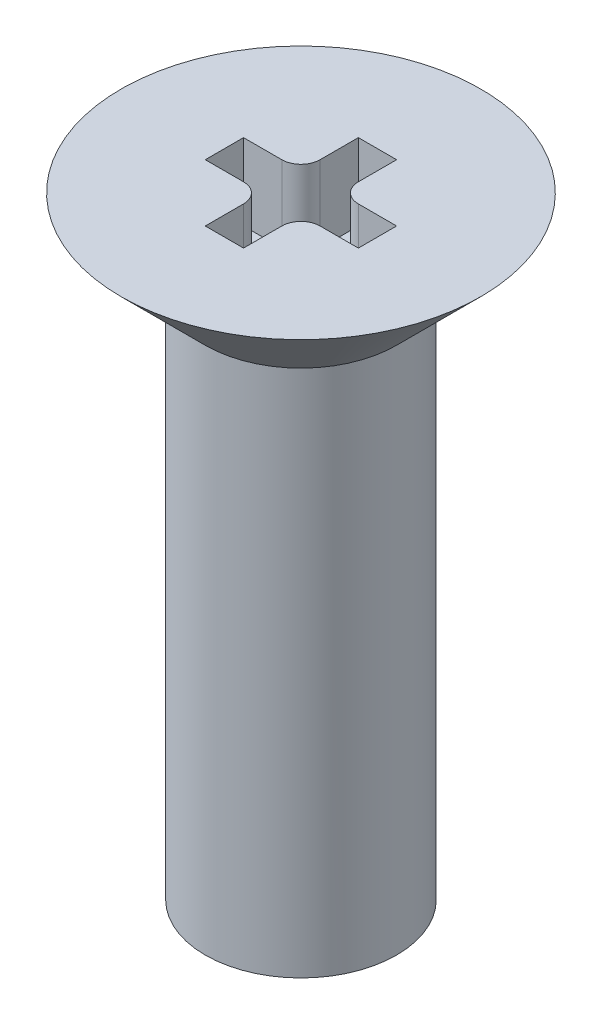
ISO-10303-21;
HEADER;
FILE_DESCRIPTION(('STEP AP214'),'2;1');
FILE_NAME('part.step','',(''),(''),'','','');
FILE_SCHEMA(('AUTOMOTIVE_DESIGN { 1 0 10303 214 1 1 1 1 }'));
ENDSEC;
DATA;
#1=APPLICATION_CONTEXT('core data for automotive mechanical design processes');
#2=APPLICATION_PROTOCOL_DEFINITION('international standard','automotive_design',2000,#1);
#3=PRODUCT_CONTEXT('',#1,'mechanical');
#4=PRODUCT('Part','Part','',(#3));
#5=PRODUCT_RELATED_PRODUCT_CATEGORY('part','',(#4));
#6=PRODUCT_DEFINITION_FORMATION('','',#4);
#7=PRODUCT_DEFINITION_CONTEXT('part definition',#1,'design');
#8=PRODUCT_DEFINITION('design','',#6,#7);
#9=PRODUCT_DEFINITION_SHAPE('','',#8);
#10=(LENGTH_UNIT() NAMED_UNIT(*) SI_UNIT(.MILLI.,.METRE.));
#11=(NAMED_UNIT(*) PLANE_ANGLE_UNIT() SI_UNIT($,.RADIAN.));
#12=(NAMED_UNIT(*) SI_UNIT($,.STERADIAN.) SOLID_ANGLE_UNIT());
#13=UNCERTAINTY_MEASURE_WITH_UNIT(LENGTH_MEASURE(1.E-05),#10,'distance_accuracy_value','');
#14=(GEOMETRIC_REPRESENTATION_CONTEXT(3) GLOBAL_UNCERTAINTY_ASSIGNED_CONTEXT((#13)) GLOBAL_UNIT_ASSIGNED_CONTEXT((#10,
#11,#12)) REPRESENTATION_CONTEXT('',''));
#15=CARTESIAN_POINT('',(0.,0.,0.));
#16=DIRECTION('',(0.,0.,1.));
#17=DIRECTION('',(1.,0.,0.));
#18=AXIS2_PLACEMENT_3D('',#15,#16,#17);
#19=CARTESIAN_POINT('',(0.,0.,0.));
#20=DIRECTION('',(0.,1.,0.));
#21=DIRECTION('',(0.,0.,1.));
#22=AXIS2_PLACEMENT_3D('',#19,#20,#21);
#23=PLANE('',#22);
#24=CARTESIAN_POINT('',(0.,0.,0.));
#25=DIRECTION('',(0.,1.,0.));
#26=DIRECTION('',(0.,0.,1.));
#27=AXIS2_PLACEMENT_3D('',#24,#25,#26);
#28=CIRCLE('',#27,2.35);
#29=CARTESIAN_POINT('',(0.,0.,2.35));
#30=VERTEX_POINT('',#29);
#31=EDGE_CURVE('E11',#30,#30,#28,.T.);
#32=ORIENTED_EDGE('',*,*,#31,.T.);
#33=EDGE_LOOP('',(#32));
#34=FACE_BOUND('',#33,.T.);
#35=DIRECTION('',(-1.,0.,0.));
#36=VECTOR('',#35,1.);
#37=CARTESIAN_POINT('',(0.5,0.,-0.25));
#38=LINE('',#37,#36);
#39=CARTESIAN_POINT('',(0.999999999999998,0.,-0.25));
#40=VERTEX_POINT('',#39);
#41=CARTESIAN_POINT('',(0.499999999999998,0.,-0.25));
#42=VERTEX_POINT('',#41);
#43=EDGE_CURVE('E47',#40,#42,#38,.T.);
#44=ORIENTED_EDGE('',*,*,#43,.F.);
#45=DIRECTION('',(0.,0.,-1.));
#46=VECTOR('',#45,1.);
#47=CARTESIAN_POINT('',(0.999999999999998,0.,0.25));
#48=LINE('',#47,#46);
#49=CARTESIAN_POINT('',(0.999999999999998,0.,0.25));
#50=VERTEX_POINT('',#49);
#51=EDGE_CURVE('E220',#50,#40,#48,.T.);
#52=ORIENTED_EDGE('',*,*,#51,.F.);
#53=DIRECTION('',(1.,0.,0.));
#54=VECTOR('',#53,1.);
#55=CARTESIAN_POINT('',(0.5,0.,0.25));
#56=LINE('',#55,#54);
#57=CARTESIAN_POINT('',(0.5,0.,0.25));
#58=VERTEX_POINT('',#57);
#59=EDGE_CURVE('E218',#58,#50,#56,.T.);
#60=ORIENTED_EDGE('',*,*,#59,.F.);
#61=CARTESIAN_POINT('',(0.499999999999998,0.,0.5));
#62=DIRECTION('',(0.,-1.,0.));
#63=DIRECTION('',(0.,0.,1.));
#64=AXIS2_PLACEMENT_3D('',#61,#62,#63);
#65=CIRCLE('',#64,0.25);
#66=CARTESIAN_POINT('',(0.249999999999998,0.,0.500000000000002));
#67=VERTEX_POINT('',#66);
#68=EDGE_CURVE('E155',#67,#58,#65,.T.);
#69=ORIENTED_EDGE('',*,*,#68,.F.);
#70=DIRECTION('',(0.,0.,-1.));
#71=VECTOR('',#70,1.);
#72=CARTESIAN_POINT('',(0.249999999999998,0.,1.));
#73=LINE('',#72,#71);
#74=CARTESIAN_POINT('',(0.249999999999998,0.,1.));
#75=VERTEX_POINT('',#74);
#76=EDGE_CURVE('E214',#75,#67,#73,.T.);
#77=ORIENTED_EDGE('',*,*,#76,.F.);
#78=DIRECTION('',(1.,0.,0.));
#79=VECTOR('',#78,1.);
#80=CARTESIAN_POINT('',(-0.250000000000002,0.,1.));
#81=LINE('',#80,#79);
#82=CARTESIAN_POINT('',(-0.250000000000002,0.,1.));
#83=VERTEX_POINT('',#82);
#84=EDGE_CURVE('E211',#83,#75,#81,.T.);
#85=ORIENTED_EDGE('',*,*,#84,.F.);
#86=DIRECTION('',(0.,0.,1.));
#87=VECTOR('',#86,1.);
#88=CARTESIAN_POINT('',(-0.250000000000002,0.,1.));
#89=LINE('',#88,#87);
#90=CARTESIAN_POINT('',(-0.250000000000002,0.,0.500000000000002));
#91=VERTEX_POINT('',#90);
#92=EDGE_CURVE('E208',#91,#83,#89,.T.);
#93=ORIENTED_EDGE('',*,*,#92,.F.);
#94=CARTESIAN_POINT('',(-0.500000000000002,0.,0.5));
#95=DIRECTION('',(0.,-1.,0.));
#96=DIRECTION('',(0.,0.,1.));
#97=AXIS2_PLACEMENT_3D('',#94,#95,#96);
#98=CIRCLE('',#97,0.25);
#99=CARTESIAN_POINT('',(-0.500000000000003,0.,0.25));
#100=VERTEX_POINT('',#99);
#101=EDGE_CURVE('E205',#100,#91,#98,.T.);
#102=ORIENTED_EDGE('',*,*,#101,.F.);
#103=DIRECTION('',(1.,0.,0.));
#104=VECTOR('',#103,1.);
#105=CARTESIAN_POINT('',(-1.,0.,0.25));
#106=LINE('',#105,#104);
#107=CARTESIAN_POINT('',(-1.,0.,0.25));
#108=VERTEX_POINT('',#107);
#109=EDGE_CURVE('E202',#108,#100,#106,.T.);
#110=ORIENTED_EDGE('',*,*,#109,.F.);
#111=DIRECTION('',(0.,0.,1.));
#112=VECTOR('',#111,1.);
#113=CARTESIAN_POINT('',(-1.,0.,0.25));
#114=LINE('',#113,#112);
#115=CARTESIAN_POINT('',(-1.,0.,-0.25));
#116=VERTEX_POINT('',#115);
#117=EDGE_CURVE('E199',#116,#108,#114,.T.);
#118=ORIENTED_EDGE('',*,*,#117,.F.);
#119=DIRECTION('',(-1.,0.,0.));
#120=VECTOR('',#119,1.);
#121=CARTESIAN_POINT('',(-1.,0.,-0.25));
#122=LINE('',#121,#120);
#123=CARTESIAN_POINT('',(-0.500000000000003,0.,-0.25));
#124=VERTEX_POINT('',#123);
#125=EDGE_CURVE('E196',#124,#116,#122,.T.);
#126=ORIENTED_EDGE('',*,*,#125,.F.);
#127=CARTESIAN_POINT('',(-0.500000000000002,0.,-0.5));
#128=DIRECTION('',(0.,-1.,0.));
#129=DIRECTION('',(0.,0.,1.));
#130=AXIS2_PLACEMENT_3D('',#127,#128,#129);
#131=CIRCLE('',#130,0.25);
#132=CARTESIAN_POINT('',(-0.250000000000002,0.,-0.500000000000001));
#133=VERTEX_POINT('',#132);
#134=EDGE_CURVE('E193',#133,#124,#131,.T.);
#135=ORIENTED_EDGE('',*,*,#134,.F.);
#136=DIRECTION('',(0.,0.,1.));
#137=VECTOR('',#136,1.);
#138=CARTESIAN_POINT('',(-0.250000000000002,0.,-0.500000000000002));
#139=LINE('',#138,#137);
#140=CARTESIAN_POINT('',(-0.250000000000002,0.,-1.));
#141=VERTEX_POINT('',#140);
#142=EDGE_CURVE('E190',#141,#133,#139,.T.);
#143=ORIENTED_EDGE('',*,*,#142,.F.);
#144=DIRECTION('',(-1.,0.,0.));
#145=VECTOR('',#144,1.);
#146=CARTESIAN_POINT('',(-0.250000000000002,0.,-1.));
#147=LINE('',#146,#145);
#148=CARTESIAN_POINT('',(0.249999999999998,0.,-1.));
#149=VERTEX_POINT('',#148);
#150=EDGE_CURVE('E187',#149,#141,#147,.T.);
#151=ORIENTED_EDGE('',*,*,#150,.F.);
#152=DIRECTION('',(0.,0.,-1.));
#153=VECTOR('',#152,1.);
#154=CARTESIAN_POINT('',(0.249999999999998,0.,-0.500000000000002));
#155=LINE('',#154,#153);
#156=CARTESIAN_POINT('',(0.249999999999998,0.,-0.500000000000002));
#157=VERTEX_POINT('',#156);
#158=EDGE_CURVE('E184',#157,#149,#155,.T.);
#159=ORIENTED_EDGE('',*,*,#158,.F.);
#160=CARTESIAN_POINT('',(0.499999999999998,0.,-0.5));
#161=DIRECTION('',(0.,-1.,0.));
#162=DIRECTION('',(0.,0.,1.));
#163=AXIS2_PLACEMENT_3D('',#160,#161,#162);
#164=CIRCLE('',#163,0.25);
#165=EDGE_CURVE('E181',#42,#157,#164,.T.);
#166=ORIENTED_EDGE('',*,*,#165,.F.);
#167=EDGE_LOOP('',(#44,#52,#60,#69,#77,#85,#93,#102,#110,#118,#126,#135,#143,#151,#159,#166));
#168=FACE_BOUND('',#167,.T.);
#169=ADVANCED_FACE('F33',(#34,#168),#23,.T.);
#170=CARTESIAN_POINT('',(0.,0.,0.));
#171=DIRECTION('',(0.,1.,0.));
#172=DIRECTION('',(0.,0.,1.));
#173=AXIS2_PLACEMENT_3D('',#170,#171,#172);
#174=CONICAL_SURFACE('',#173,2.35,0.785398163397447);
#175=CARTESIAN_POINT('',(0.,-1.1,0.));
#176=DIRECTION('',(0.,1.,0.));
#177=DIRECTION('',(0.,0.,1.));
#178=AXIS2_PLACEMENT_3D('',#175,#176,#177);
#179=CIRCLE('',#178,1.25);
#180=CARTESIAN_POINT('',(0.,-1.1,1.25));
#181=VERTEX_POINT('',#180);
#182=EDGE_CURVE('E40',#181,#181,#179,.T.);
#183=ORIENTED_EDGE('',*,*,#182,.T.);
#184=EDGE_LOOP('',(#183));
#185=FACE_BOUND('',#184,.T.);
#186=ORIENTED_EDGE('',*,*,#31,.F.);
#187=EDGE_LOOP('',(#186));
#188=FACE_BOUND('',#187,.T.);
#189=ADVANCED_FACE('F254',(#185,#188),#174,.T.);
#190=CARTESIAN_POINT('',(0.,0.872326938896606,0.));
#191=DIRECTION('',(0.,1.,0.));
#192=DIRECTION('',(0.,0.,1.));
#193=AXIS2_PLACEMENT_3D('',#190,#191,#192);
#194=CYLINDRICAL_SURFACE('',#193,1.25);
#195=ORIENTED_EDGE('',*,*,#182,.F.);
#196=EDGE_LOOP('',(#195));
#197=FACE_BOUND('',#196,.T.);
#198=CARTESIAN_POINT('',(0.,-8.,0.));
#199=DIRECTION('',(0.,-1.,0.));
#200=DIRECTION('',(0.,0.,-1.));
#201=AXIS2_PLACEMENT_3D('',#198,#199,#200);
#202=CIRCLE('',#201,1.25);
#203=CARTESIAN_POINT('',(0.,-8.,-1.25));
#204=VERTEX_POINT('',#203);
#205=EDGE_CURVE('E224',#204,#204,#202,.T.);
#206=ORIENTED_EDGE('',*,*,#205,.F.);
#207=EDGE_LOOP('',(#206));
#208=FACE_BOUND('',#207,.T.);
#209=ADVANCED_FACE('F257',(#197,#208),#194,.T.);
#210=CARTESIAN_POINT('',(0.,-8.,0.));
#211=DIRECTION('',(0.,-1.,0.));
#212=DIRECTION('',(0.,0.,-1.));
#213=AXIS2_PLACEMENT_3D('',#210,#211,#212);
#214=PLANE('',#213);
#215=ORIENTED_EDGE('',*,*,#205,.T.);
#216=EDGE_LOOP('',(#215));
#217=FACE_BOUND('',#216,.T.);
#218=ADVANCED_FACE('F260',(#217),#214,.T.);
#219=CARTESIAN_POINT('',(0.5,-1.,-0.25));
#220=DIRECTION('',(0.,0.,-1.));
#221=DIRECTION('',(-1.,0.,0.));
#222=AXIS2_PLACEMENT_3D('',#219,#220,#221);
#223=PLANE('',#222);
#224=ORIENTED_EDGE('',*,*,#43,.T.);
#225=DIRECTION('',(0.,1.,0.));
#226=VECTOR('',#225,1.);
#227=CARTESIAN_POINT('',(0.499999999999998,-1.,-0.25));
#228=LINE('',#227,#226);
#229=CARTESIAN_POINT('',(0.499999999999998,-1.,-0.25));
#230=VERTEX_POINT('',#229);
#231=EDGE_CURVE('E107',#230,#42,#228,.T.);
#232=ORIENTED_EDGE('',*,*,#231,.F.);
#233=DIRECTION('',(-1.,0.,0.));
#234=VECTOR('',#233,1.);
#235=CARTESIAN_POINT('',(0.5,-1.,-0.25));
#236=LINE('',#235,#234);
#237=CARTESIAN_POINT('',(0.999999999999998,-1.,-0.25));
#238=VERTEX_POINT('',#237);
#239=EDGE_CURVE('E222',#238,#230,#236,.T.);
#240=ORIENTED_EDGE('',*,*,#239,.F.);
#241=DIRECTION('',(0.,1.,0.));
#242=VECTOR('',#241,1.);
#243=CARTESIAN_POINT('',(0.999999999999998,-1.,-0.25));
#244=LINE('',#243,#242);
#245=EDGE_CURVE('E55',#238,#40,#244,.T.);
#246=ORIENTED_EDGE('',*,*,#245,.T.);
#247=EDGE_LOOP('',(#224,#232,#240,#246));
#248=FACE_BOUND('',#247,.T.);
#249=ADVANCED_FACE('F265',(#248),#223,.F.);
#250=CARTESIAN_POINT('',(0.999999999999998,-1.,0.25));
#251=DIRECTION('',(1.,0.,0.));
#252=DIRECTION('',(0.,0.,-1.));
#253=AXIS2_PLACEMENT_3D('',#250,#251,#252);
#254=PLANE('',#253);
#255=ORIENTED_EDGE('',*,*,#51,.T.);
#256=ORIENTED_EDGE('',*,*,#245,.F.);
#257=DIRECTION('',(0.,0.,-1.));
#258=VECTOR('',#257,1.);
#259=CARTESIAN_POINT('',(0.999999999999998,-1.,0.25));
#260=LINE('',#259,#258);
#261=CARTESIAN_POINT('',(0.999999999999998,-1.,0.25));
#262=VERTEX_POINT('',#261);
#263=EDGE_CURVE('E167',#262,#238,#260,.T.);
#264=ORIENTED_EDGE('',*,*,#263,.F.);
#265=DIRECTION('',(0.,1.,0.));
#266=VECTOR('',#265,1.);
#267=CARTESIAN_POINT('',(0.999999999999998,-1.,0.25));
#268=LINE('',#267,#266);
#269=EDGE_CURVE('E159',#262,#50,#268,.T.);
#270=ORIENTED_EDGE('',*,*,#269,.T.);
#271=EDGE_LOOP('',(#255,#256,#264,#270));
#272=FACE_BOUND('',#271,.T.);
#273=ADVANCED_FACE('F270',(#272),#254,.F.);
#274=CARTESIAN_POINT('',(0.5,-1.,0.25));
#275=DIRECTION('',(0.,0.,1.));
#276=DIRECTION('',(1.,0.,0.));
#277=AXIS2_PLACEMENT_3D('',#274,#275,#276);
#278=PLANE('',#277);
#279=ORIENTED_EDGE('',*,*,#59,.T.);
#280=ORIENTED_EDGE('',*,*,#269,.F.);
#281=DIRECTION('',(1.,0.,0.));
#282=VECTOR('',#281,1.);
#283=CARTESIAN_POINT('',(0.5,-1.,0.25));
#284=LINE('',#283,#282);
#285=CARTESIAN_POINT('',(0.5,-1.,0.25));
#286=VERTEX_POINT('',#285);
#287=EDGE_CURVE('E163',#286,#262,#284,.T.);
#288=ORIENTED_EDGE('',*,*,#287,.F.);
#289=DIRECTION('',(0.,1.,0.));
#290=VECTOR('',#289,1.);
#291=CARTESIAN_POINT('',(0.5,-1.,0.25));
#292=LINE('',#291,#290);
#293=EDGE_CURVE('E148',#286,#58,#292,.T.);
#294=ORIENTED_EDGE('',*,*,#293,.T.);
#295=EDGE_LOOP('',(#279,#280,#288,#294));
#296=FACE_BOUND('',#295,.T.);
#297=ADVANCED_FACE('F164',(#296),#278,.F.);
#298=CARTESIAN_POINT('',(0.499999999999998,-1.,0.5));
#299=DIRECTION('',(0.,1.,0.));
#300=DIRECTION('',(0.,0.,1.));
#301=AXIS2_PLACEMENT_3D('',#298,#299,#300);
#302=CYLINDRICAL_SURFACE('',#301,0.25);
#303=ORIENTED_EDGE('',*,*,#68,.T.);
#304=ORIENTED_EDGE('',*,*,#293,.F.);
#305=CARTESIAN_POINT('',(0.499999999999998,-1.,0.5));
#306=DIRECTION('',(0.,-1.,0.));
#307=DIRECTION('',(0.,0.,1.));
#308=AXIS2_PLACEMENT_3D('',#305,#306,#307);
#309=CIRCLE('',#308,0.25);
#310=CARTESIAN_POINT('',(0.249999999999998,-1.,0.500000000000002));
#311=VERTEX_POINT('',#310);
#312=EDGE_CURVE('E152',#311,#286,#309,.T.);
#313=ORIENTED_EDGE('',*,*,#312,.F.);
#314=DIRECTION('',(0.,1.,0.));
#315=VECTOR('',#314,1.);
#316=CARTESIAN_POINT('',(0.249999999999998,-1.,0.500000000000002));
#317=LINE('',#316,#315);
#318=EDGE_CURVE('E160',#311,#67,#317,.T.);
#319=ORIENTED_EDGE('',*,*,#318,.T.);
#320=EDGE_LOOP('',(#303,#304,#313,#319));
#321=FACE_BOUND('',#320,.T.);
#322=ADVANCED_FACE('F150',(#321),#302,.T.);
#323=CARTESIAN_POINT('',(0.249999999999998,-1.,1.));
#324=DIRECTION('',(1.,0.,0.));
#325=DIRECTION('',(0.,0.,-1.));
#326=AXIS2_PLACEMENT_3D('',#323,#324,#325);
#327=PLANE('',#326);
#328=ORIENTED_EDGE('',*,*,#76,.T.);
#329=ORIENTED_EDGE('',*,*,#318,.F.);
#330=DIRECTION('',(0.,0.,-1.));
#331=VECTOR('',#330,1.);
#332=CARTESIAN_POINT('',(0.249999999999998,-1.,1.));
#333=LINE('',#332,#331);
#334=CARTESIAN_POINT('',(0.249999999999998,-1.,1.));
#335=VERTEX_POINT('',#334);
#336=EDGE_CURVE('E173',#335,#311,#333,.T.);
#337=ORIENTED_EDGE('',*,*,#336,.F.);
#338=DIRECTION('',(0.,1.,0.));
#339=VECTOR('',#338,1.);
#340=CARTESIAN_POINT('',(0.249999999999998,-1.,1.));
#341=LINE('',#340,#339);
#342=EDGE_CURVE('E227',#335,#75,#341,.T.);
#343=ORIENTED_EDGE('',*,*,#342,.T.);
#344=EDGE_LOOP('',(#328,#329,#337,#343));
#345=FACE_BOUND('',#344,.T.);
#346=ADVANCED_FACE('F324',(#345),#327,.F.);
#347=CARTESIAN_POINT('',(-0.250000000000002,-1.,1.));
#348=DIRECTION('',(0.,0.,1.));
#349=DIRECTION('',(1.,0.,0.));
#350=AXIS2_PLACEMENT_3D('',#347,#348,#349);
#351=PLANE('',#350);
#352=ORIENTED_EDGE('',*,*,#84,.T.);
#353=ORIENTED_EDGE('',*,*,#342,.F.);
#354=DIRECTION('',(1.,0.,0.));
#355=VECTOR('',#354,1.);
#356=CARTESIAN_POINT('',(-0.250000000000002,-1.,1.));
#357=LINE('',#356,#355);
#358=CARTESIAN_POINT('',(-0.250000000000002,-1.,1.));
#359=VERTEX_POINT('',#358);
#360=EDGE_CURVE('E175',#359,#335,#357,.T.);
#361=ORIENTED_EDGE('',*,*,#360,.F.);
#362=DIRECTION('',(0.,1.,0.));
#363=VECTOR('',#362,1.);
#364=CARTESIAN_POINT('',(-0.250000000000002,-1.,1.));
#365=LINE('',#364,#363);
#366=EDGE_CURVE('E229',#359,#83,#365,.T.);
#367=ORIENTED_EDGE('',*,*,#366,.T.);
#368=EDGE_LOOP('',(#352,#353,#361,#367));
#369=FACE_BOUND('',#368,.T.);
#370=ADVANCED_FACE('F320',(#369),#351,.F.);
#371=CARTESIAN_POINT('',(-0.250000000000002,-1.,1.));
#372=DIRECTION('',(-1.,0.,0.));
#373=DIRECTION('',(0.,0.,1.));
#374=AXIS2_PLACEMENT_3D('',#371,#372,#373);
#375=PLANE('',#374);
#376=ORIENTED_EDGE('',*,*,#92,.T.);
#377=ORIENTED_EDGE('',*,*,#366,.F.);
#378=DIRECTION('',(0.,0.,1.));
#379=VECTOR('',#378,1.);
#380=CARTESIAN_POINT('',(-0.250000000000002,-1.,1.));
#381=LINE('',#380,#379);
#382=CARTESIAN_POINT('',(-0.250000000000002,-1.,0.500000000000002));
#383=VERTEX_POINT('',#382);
#384=EDGE_CURVE('E315',#383,#359,#381,.T.);
#385=ORIENTED_EDGE('',*,*,#384,.F.);
#386=DIRECTION('',(0.,1.,0.));
#387=VECTOR('',#386,1.);
#388=CARTESIAN_POINT('',(-0.250000000000002,-1.,0.500000000000002));
#389=LINE('',#388,#387);
#390=EDGE_CURVE('E231',#383,#91,#389,.T.);
#391=ORIENTED_EDGE('',*,*,#390,.T.);
#392=EDGE_LOOP('',(#376,#377,#385,#391));
#393=FACE_BOUND('',#392,.T.);
#394=ADVANCED_FACE('F329',(#393),#375,.F.);
#395=CARTESIAN_POINT('',(-0.500000000000002,-1.,0.5));
#396=DIRECTION('',(0.,1.,0.));
#397=DIRECTION('',(0.,0.,1.));
#398=AXIS2_PLACEMENT_3D('',#395,#396,#397);
#399=CYLINDRICAL_SURFACE('',#398,0.25);
#400=ORIENTED_EDGE('',*,*,#101,.T.);
#401=ORIENTED_EDGE('',*,*,#390,.F.);
#402=CARTESIAN_POINT('',(-0.500000000000002,-1.,0.5));
#403=DIRECTION('',(0.,-1.,0.));
#404=DIRECTION('',(0.,0.,1.));
#405=AXIS2_PLACEMENT_3D('',#402,#403,#404);
#406=CIRCLE('',#405,0.25);
#407=CARTESIAN_POINT('',(-0.500000000000003,-1.,0.25));
#408=VERTEX_POINT('',#407);
#409=EDGE_CURVE('E312',#408,#383,#406,.T.);
#410=ORIENTED_EDGE('',*,*,#409,.F.);
#411=DIRECTION('',(0.,1.,0.));
#412=VECTOR('',#411,1.);
#413=CARTESIAN_POINT('',(-0.500000000000003,-1.,0.25));
#414=LINE('',#413,#412);
#415=EDGE_CURVE('E233',#408,#100,#414,.T.);
#416=ORIENTED_EDGE('',*,*,#415,.T.);
#417=EDGE_LOOP('',(#400,#401,#410,#416));
#418=FACE_BOUND('',#417,.T.);
#419=ADVANCED_FACE('F332',(#418),#399,.T.);
#420=CARTESIAN_POINT('',(-1.,-1.,0.25));
#421=DIRECTION('',(0.,0.,1.));
#422=DIRECTION('',(1.,0.,0.));
#423=AXIS2_PLACEMENT_3D('',#420,#421,#422);
#424=PLANE('',#423);
#425=ORIENTED_EDGE('',*,*,#109,.T.);
#426=ORIENTED_EDGE('',*,*,#415,.F.);
#427=DIRECTION('',(1.,0.,0.));
#428=VECTOR('',#427,1.);
#429=CARTESIAN_POINT('',(-1.,-1.,0.25));
#430=LINE('',#429,#428);
#431=CARTESIAN_POINT('',(-1.,-1.,0.25));
#432=VERTEX_POINT('',#431);
#433=EDGE_CURVE('E309',#432,#408,#430,.T.);
#434=ORIENTED_EDGE('',*,*,#433,.F.);
#435=DIRECTION('',(0.,1.,0.));
#436=VECTOR('',#435,1.);
#437=CARTESIAN_POINT('',(-1.,-1.,0.25));
#438=LINE('',#437,#436);
#439=EDGE_CURVE('E235',#432,#108,#438,.T.);
#440=ORIENTED_EDGE('',*,*,#439,.T.);
#441=EDGE_LOOP('',(#425,#426,#434,#440));
#442=FACE_BOUND('',#441,.T.);
#443=ADVANCED_FACE('F335',(#442),#424,.F.);
#444=CARTESIAN_POINT('',(-1.,-1.,0.25));
#445=DIRECTION('',(-1.,0.,0.));
#446=DIRECTION('',(0.,0.,1.));
#447=AXIS2_PLACEMENT_3D('',#444,#445,#446);
#448=PLANE('',#447);
#449=ORIENTED_EDGE('',*,*,#117,.T.);
#450=ORIENTED_EDGE('',*,*,#439,.F.);
#451=DIRECTION('',(0.,0.,1.));
#452=VECTOR('',#451,1.);
#453=CARTESIAN_POINT('',(-1.,-1.,0.25));
#454=LINE('',#453,#452);
#455=CARTESIAN_POINT('',(-1.,-1.,-0.25));
#456=VERTEX_POINT('',#455);
#457=EDGE_CURVE('E306',#456,#432,#454,.T.);
#458=ORIENTED_EDGE('',*,*,#457,.F.);
#459=DIRECTION('',(0.,1.,0.));
#460=VECTOR('',#459,1.);
#461=CARTESIAN_POINT('',(-1.,-1.,-0.25));
#462=LINE('',#461,#460);
#463=EDGE_CURVE('E237',#456,#116,#462,.T.);
#464=ORIENTED_EDGE('',*,*,#463,.T.);
#465=EDGE_LOOP('',(#449,#450,#458,#464));
#466=FACE_BOUND('',#465,.T.);
#467=ADVANCED_FACE('F340',(#466),#448,.F.);
#468=CARTESIAN_POINT('',(-1.,-1.,-0.25));
#469=DIRECTION('',(0.,0.,-1.));
#470=DIRECTION('',(-1.,0.,0.));
#471=AXIS2_PLACEMENT_3D('',#468,#469,#470);
#472=PLANE('',#471);
#473=ORIENTED_EDGE('',*,*,#125,.T.);
#474=ORIENTED_EDGE('',*,*,#463,.F.);
#475=DIRECTION('',(-1.,0.,0.));
#476=VECTOR('',#475,1.);
#477=CARTESIAN_POINT('',(-1.,-1.,-0.25));
#478=LINE('',#477,#476);
#479=CARTESIAN_POINT('',(-0.500000000000003,-1.,-0.25));
#480=VERTEX_POINT('',#479);
#481=EDGE_CURVE('E303',#480,#456,#478,.T.);
#482=ORIENTED_EDGE('',*,*,#481,.F.);
#483=DIRECTION('',(0.,1.,0.));
#484=VECTOR('',#483,1.);
#485=CARTESIAN_POINT('',(-0.500000000000003,-1.,-0.25));
#486=LINE('',#485,#484);
#487=EDGE_CURVE('E239',#480,#124,#486,.T.);
#488=ORIENTED_EDGE('',*,*,#487,.T.);
#489=EDGE_LOOP('',(#473,#474,#482,#488));
#490=FACE_BOUND('',#489,.T.);
#491=ADVANCED_FACE('F344',(#490),#472,.F.);
#492=CARTESIAN_POINT('',(-0.500000000000002,-1.,-0.5));
#493=DIRECTION('',(0.,1.,0.));
#494=DIRECTION('',(0.,0.,1.));
#495=AXIS2_PLACEMENT_3D('',#492,#493,#494);
#496=CYLINDRICAL_SURFACE('',#495,0.25);
#497=ORIENTED_EDGE('',*,*,#134,.T.);
#498=ORIENTED_EDGE('',*,*,#487,.F.);
#499=CARTESIAN_POINT('',(-0.500000000000002,-1.,-0.5));
#500=DIRECTION('',(0.,-1.,0.));
#501=DIRECTION('',(0.,0.,1.));
#502=AXIS2_PLACEMENT_3D('',#499,#500,#501);
#503=CIRCLE('',#502,0.25);
#504=CARTESIAN_POINT('',(-0.250000000000002,-1.,-0.500000000000001));
#505=VERTEX_POINT('',#504);
#506=EDGE_CURVE('E300',#505,#480,#503,.T.);
#507=ORIENTED_EDGE('',*,*,#506,.F.);
#508=DIRECTION('',(0.,1.,0.));
#509=VECTOR('',#508,1.);
#510=CARTESIAN_POINT('',(-0.250000000000002,-1.,-0.500000000000001));
#511=LINE('',#510,#509);
#512=EDGE_CURVE('E241',#505,#133,#511,.T.);
#513=ORIENTED_EDGE('',*,*,#512,.T.);
#514=EDGE_LOOP('',(#497,#498,#507,#513));
#515=FACE_BOUND('',#514,.T.);
#516=ADVANCED_FACE('F347',(#515),#496,.T.);
#517=CARTESIAN_POINT('',(-0.250000000000002,-1.,-0.500000000000002));
#518=DIRECTION('',(-1.,0.,0.));
#519=DIRECTION('',(0.,0.,1.));
#520=AXIS2_PLACEMENT_3D('',#517,#518,#519);
#521=PLANE('',#520);
#522=ORIENTED_EDGE('',*,*,#142,.T.);
#523=ORIENTED_EDGE('',*,*,#512,.F.);
#524=DIRECTION('',(0.,0.,1.));
#525=VECTOR('',#524,1.);
#526=CARTESIAN_POINT('',(-0.250000000000002,-1.,-0.500000000000002));
#527=LINE('',#526,#525);
#528=CARTESIAN_POINT('',(-0.250000000000002,-1.,-1.));
#529=VERTEX_POINT('',#528);
#530=EDGE_CURVE('E297',#529,#505,#527,.T.);
#531=ORIENTED_EDGE('',*,*,#530,.F.);
#532=DIRECTION('',(0.,1.,0.));
#533=VECTOR('',#532,1.);
#534=CARTESIAN_POINT('',(-0.250000000000002,-1.,-1.));
#535=LINE('',#534,#533);
#536=EDGE_CURVE('E243',#529,#141,#535,.T.);
#537=ORIENTED_EDGE('',*,*,#536,.T.);
#538=EDGE_LOOP('',(#522,#523,#531,#537));
#539=FACE_BOUND('',#538,.T.);
#540=ADVANCED_FACE('F350',(#539),#521,.F.);
#541=CARTESIAN_POINT('',(-0.250000000000002,-1.,-1.));
#542=DIRECTION('',(0.,0.,-1.));
#543=DIRECTION('',(-1.,0.,0.));
#544=AXIS2_PLACEMENT_3D('',#541,#542,#543);
#545=PLANE('',#544);
#546=ORIENTED_EDGE('',*,*,#150,.T.);
#547=ORIENTED_EDGE('',*,*,#536,.F.);
#548=DIRECTION('',(-1.,0.,0.));
#549=VECTOR('',#548,1.);
#550=CARTESIAN_POINT('',(-0.250000000000002,-1.,-1.));
#551=LINE('',#550,#549);
#552=CARTESIAN_POINT('',(0.249999999999998,-1.,-1.));
#553=VERTEX_POINT('',#552);
#554=EDGE_CURVE('E294',#553,#529,#551,.T.);
#555=ORIENTED_EDGE('',*,*,#554,.F.);
#556=DIRECTION('',(0.,1.,0.));
#557=VECTOR('',#556,1.);
#558=CARTESIAN_POINT('',(0.249999999999998,-1.,-1.));
#559=LINE('',#558,#557);
#560=EDGE_CURVE('E245',#553,#149,#559,.T.);
#561=ORIENTED_EDGE('',*,*,#560,.T.);
#562=EDGE_LOOP('',(#546,#547,#555,#561));
#563=FACE_BOUND('',#562,.T.);
#564=ADVANCED_FACE('F354',(#563),#545,.F.);
#565=CARTESIAN_POINT('',(0.249999999999998,-1.,-0.500000000000002));
#566=DIRECTION('',(1.,0.,0.));
#567=DIRECTION('',(0.,0.,-1.));
#568=AXIS2_PLACEMENT_3D('',#565,#566,#567);
#569=PLANE('',#568);
#570=ORIENTED_EDGE('',*,*,#158,.T.);
#571=ORIENTED_EDGE('',*,*,#560,.F.);
#572=DIRECTION('',(0.,0.,-1.));
#573=VECTOR('',#572,1.);
#574=CARTESIAN_POINT('',(0.249999999999998,-1.,-0.500000000000002));
#575=LINE('',#574,#573);
#576=CARTESIAN_POINT('',(0.249999999999998,-1.,-0.500000000000002));
#577=VERTEX_POINT('',#576);
#578=EDGE_CURVE('E289',#577,#553,#575,.T.);
#579=ORIENTED_EDGE('',*,*,#578,.F.);
#580=DIRECTION('',(0.,1.,0.));
#581=VECTOR('',#580,1.);
#582=CARTESIAN_POINT('',(0.249999999999998,-1.,-0.500000000000002));
#583=LINE('',#582,#581);
#584=EDGE_CURVE('E247',#577,#157,#583,.T.);
#585=ORIENTED_EDGE('',*,*,#584,.T.);
#586=EDGE_LOOP('',(#570,#571,#579,#585));
#587=FACE_BOUND('',#586,.T.);
#588=ADVANCED_FACE('F356',(#587),#569,.F.);
#589=CARTESIAN_POINT('',(0.499999999999998,-1.,-0.5));
#590=DIRECTION('',(0.,1.,0.));
#591=DIRECTION('',(0.,0.,1.));
#592=AXIS2_PLACEMENT_3D('',#589,#590,#591);
#593=CYLINDRICAL_SURFACE('',#592,0.25);
#594=ORIENTED_EDGE('',*,*,#165,.T.);
#595=ORIENTED_EDGE('',*,*,#584,.F.);
#596=CARTESIAN_POINT('',(0.499999999999998,-1.,-0.5));
#597=DIRECTION('',(0.,-1.,0.));
#598=DIRECTION('',(0.,0.,1.));
#599=AXIS2_PLACEMENT_3D('',#596,#597,#598);
#600=CIRCLE('',#599,0.25);
#601=EDGE_CURVE('E287',#230,#577,#600,.T.);
#602=ORIENTED_EDGE('',*,*,#601,.F.);
#603=ORIENTED_EDGE('',*,*,#231,.T.);
#604=EDGE_LOOP('',(#594,#595,#602,#603));
#605=FACE_BOUND('',#604,.T.);
#606=ADVANCED_FACE('F284',(#605),#593,.T.);
#607=CARTESIAN_POINT('',(0.499999999999998,-1.,0.5));
#608=DIRECTION('',(0.,1.,0.));
#609=DIRECTION('',(0.,0.,1.));
#610=AXIS2_PLACEMENT_3D('',#607,#608,#609);
#611=PLANE('',#610);
#612=ORIENTED_EDGE('',*,*,#239,.T.);
#613=ORIENTED_EDGE('',*,*,#601,.T.);
#614=ORIENTED_EDGE('',*,*,#578,.T.);
#615=ORIENTED_EDGE('',*,*,#554,.T.);
#616=ORIENTED_EDGE('',*,*,#530,.T.);
#617=ORIENTED_EDGE('',*,*,#506,.T.);
#618=ORIENTED_EDGE('',*,*,#481,.T.);
#619=ORIENTED_EDGE('',*,*,#457,.T.);
#620=ORIENTED_EDGE('',*,*,#433,.T.);
#621=ORIENTED_EDGE('',*,*,#409,.T.);
#622=ORIENTED_EDGE('',*,*,#384,.T.);
#623=ORIENTED_EDGE('',*,*,#360,.T.);
#624=ORIENTED_EDGE('',*,*,#336,.T.);
#625=ORIENTED_EDGE('',*,*,#312,.T.);
#626=ORIENTED_EDGE('',*,*,#287,.T.);
#627=ORIENTED_EDGE('',*,*,#263,.T.);
#628=EDGE_LOOP('',(#612,#613,#614,#615,#616,#617,#618,#619,#620,#621,#622,#623,#624,#625,#626,#627));
#629=FACE_BOUND('',#628,.T.);
#630=ADVANCED_FACE('F170',(#629),#611,.T.);
#631=CLOSED_SHELL('',(#169,#189,#209,#218,#249,#273,#297,#322,#346,#370,#394,#419,#443,#467,
#491,#516,#540,#564,#588,#606,#630));
#632=MANIFOLD_SOLID_BREP('B2',#631);
#633=ADVANCED_BREP_SHAPE_REPRESENTATION('',(#18,#632),#14);
#634=SHAPE_DEFINITION_REPRESENTATION(#9,#633);
ENDSEC;
END-ISO-10303-21;
